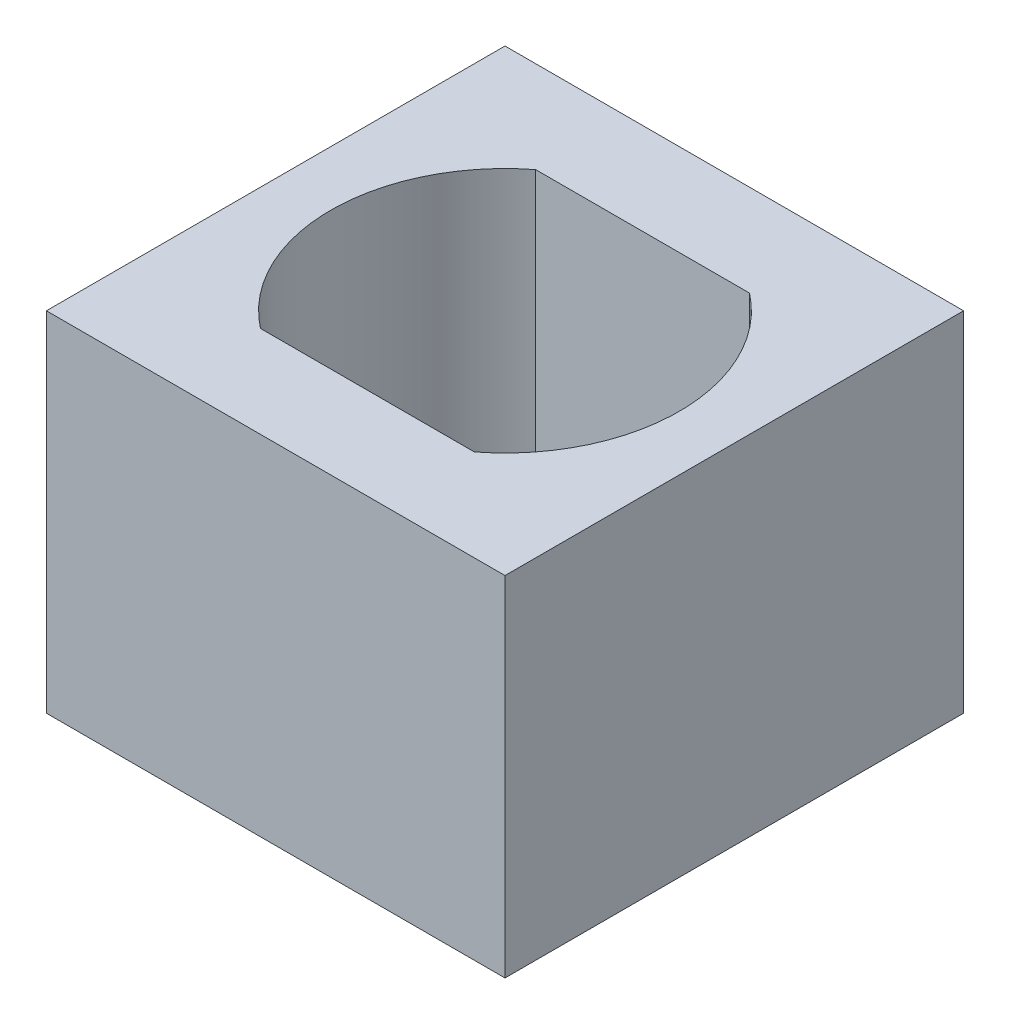
ISO-10303-21;
HEADER;
FILE_DESCRIPTION(('STEP AP214'),'2;1');
FILE_NAME('part.step','',(''),(''),'','','');
FILE_SCHEMA(('AUTOMOTIVE_DESIGN { 1 0 10303 214 1 1 1 1 }'));
ENDSEC;
DATA;
#1=APPLICATION_CONTEXT('core data for automotive mechanical design processes');
#2=APPLICATION_PROTOCOL_DEFINITION('international standard','automotive_design',2000,#1);
#3=PRODUCT_CONTEXT('',#1,'mechanical');
#4=PRODUCT('Part','Part','',(#3));
#5=PRODUCT_RELATED_PRODUCT_CATEGORY('part','',(#4));
#6=PRODUCT_DEFINITION_FORMATION('','',#4);
#7=PRODUCT_DEFINITION_CONTEXT('part definition',#1,'design');
#8=PRODUCT_DEFINITION('design','',#6,#7);
#9=PRODUCT_DEFINITION_SHAPE('','',#8);
#10=(LENGTH_UNIT() NAMED_UNIT(*) SI_UNIT(.MILLI.,.METRE.));
#11=(NAMED_UNIT(*) PLANE_ANGLE_UNIT() SI_UNIT($,.RADIAN.));
#12=(NAMED_UNIT(*) SI_UNIT($,.STERADIAN.) SOLID_ANGLE_UNIT());
#13=UNCERTAINTY_MEASURE_WITH_UNIT(LENGTH_MEASURE(1.E-05),#10,'distance_accuracy_value','');
#14=(GEOMETRIC_REPRESENTATION_CONTEXT(3) GLOBAL_UNCERTAINTY_ASSIGNED_CONTEXT((#13)) GLOBAL_UNIT_ASSIGNED_CONTEXT((#10,
#11,#12)) REPRESENTATION_CONTEXT('',''));
#15=CARTESIAN_POINT('',(0.,0.,0.));
#16=DIRECTION('',(0.,0.,1.));
#17=DIRECTION('',(1.,0.,0.));
#18=AXIS2_PLACEMENT_3D('',#15,#16,#17);
#19=CARTESIAN_POINT('',(-12.5,12.5,12.5));
#20=DIRECTION('',(-1.,0.,0.));
#21=DIRECTION('',(0.,0.,1.));
#22=AXIS2_PLACEMENT_3D('',#19,#20,#21);
#23=PLANE('',#22);
#24=DIRECTION('',(0.,-1.,0.));
#25=VECTOR('',#24,1.);
#26=CARTESIAN_POINT('',(-12.5,12.5,25.));
#27=LINE('',#26,#25);
#28=CARTESIAN_POINT('',(-12.5,6.5,25.));
#29=VERTEX_POINT('',#28);
#30=CARTESIAN_POINT('',(-12.5,-12.5,25.));
#31=VERTEX_POINT('',#30);
#32=EDGE_CURVE('E163',#29,#31,#27,.T.);
#33=ORIENTED_EDGE('',*,*,#32,.F.);
#34=DIRECTION('',(0.,0.,1.));
#35=VECTOR('',#34,1.);
#36=CARTESIAN_POINT('',(-12.5,6.5,0.));
#37=LINE('',#36,#35);
#38=CARTESIAN_POINT('',(-12.5,6.5,0.));
#39=VERTEX_POINT('',#38);
#40=EDGE_CURVE('E12',#39,#29,#37,.T.);
#41=ORIENTED_EDGE('',*,*,#40,.F.);
#42=DIRECTION('',(0.,1.,0.));
#43=VECTOR('',#42,1.);
#44=CARTESIAN_POINT('',(-12.5,0.,0.));
#45=LINE('',#44,#43);
#46=CARTESIAN_POINT('',(-12.5,-12.5,0.));
#47=VERTEX_POINT('',#46);
#48=EDGE_CURVE('E134',#47,#39,#45,.T.);
#49=ORIENTED_EDGE('',*,*,#48,.F.);
#50=DIRECTION('',(0.,0.,-1.));
#51=VECTOR('',#50,1.);
#52=CARTESIAN_POINT('',(-12.5,-12.5,12.5));
#53=LINE('',#52,#51);
#54=EDGE_CURVE('E60',#31,#47,#53,.T.);
#55=ORIENTED_EDGE('',*,*,#54,.F.);
#56=EDGE_LOOP('',(#33,#41,#49,#55));
#57=FACE_BOUND('',#56,.T.);
#58=ADVANCED_FACE('F52',(#57),#23,.T.);
#59=CARTESIAN_POINT('',(0.,-12.5,25.));
#60=DIRECTION('',(0.,-1.,0.));
#61=DIRECTION('',(0.,0.,-1.));
#62=AXIS2_PLACEMENT_3D('',#59,#60,#61);
#63=PLANE('',#62);
#64=DIRECTION('',(-1.,0.,0.));
#65=VECTOR('',#64,1.);
#66=CARTESIAN_POINT('',(0.,-12.5,0.));
#67=LINE('',#66,#65);
#68=CARTESIAN_POINT('',(12.5,-12.5,0.));
#69=VERTEX_POINT('',#68);
#70=EDGE_CURVE('E126',#69,#47,#67,.T.);
#71=ORIENTED_EDGE('',*,*,#70,.F.);
#72=DIRECTION('',(0.,0.,-1.));
#73=VECTOR('',#72,1.);
#74=CARTESIAN_POINT('',(12.5,-12.5,12.5));
#75=LINE('',#74,#73);
#76=CARTESIAN_POINT('',(12.5,-12.5,25.));
#77=VERTEX_POINT('',#76);
#78=EDGE_CURVE('E115',#77,#69,#75,.T.);
#79=ORIENTED_EDGE('',*,*,#78,.F.);
#80=DIRECTION('',(-1.,0.,0.));
#81=VECTOR('',#80,1.);
#82=CARTESIAN_POINT('',(0.,-12.5,25.));
#83=LINE('',#82,#81);
#84=EDGE_CURVE('E139',#77,#31,#83,.T.);
#85=ORIENTED_EDGE('',*,*,#84,.T.);
#86=ORIENTED_EDGE('',*,*,#54,.T.);
#87=EDGE_LOOP('',(#71,#79,#85,#86));
#88=FACE_BOUND('',#87,.T.);
#89=CARTESIAN_POINT('',(0.,-12.5,12.5));
#90=DIRECTION('',(0.,-1.,0.));
#91=DIRECTION('',(0.,0.,-1.));
#92=AXIS2_PLACEMENT_3D('',#89,#90,#91);
#93=CIRCLE('',#92,9.5);
#94=CARTESIAN_POINT('',(5.8309518948453,-12.5,5.));
#95=VERTEX_POINT('',#94);
#96=CARTESIAN_POINT('',(5.8309518948453,-12.5,20.));
#97=VERTEX_POINT('',#96);
#98=EDGE_CURVE('E159',#95,#97,#93,.T.);
#99=ORIENTED_EDGE('',*,*,#98,.F.);
#100=DIRECTION('',(-1.,0.,0.));
#101=VECTOR('',#100,1.);
#102=CARTESIAN_POINT('',(0.,-12.5,5.));
#103=LINE('',#102,#101);
#104=CARTESIAN_POINT('',(-5.8309518948453,-12.5,5.));
#105=VERTEX_POINT('',#104);
#106=EDGE_CURVE('E156',#95,#105,#103,.T.);
#107=ORIENTED_EDGE('',*,*,#106,.T.);
#108=CARTESIAN_POINT('',(0.,-12.5,12.5));
#109=DIRECTION('',(0.,-1.,0.));
#110=DIRECTION('',(0.,0.,-1.));
#111=AXIS2_PLACEMENT_3D('',#108,#109,#110);
#112=CIRCLE('',#111,9.5);
#113=CARTESIAN_POINT('',(-5.83095189484531,-12.5,20.));
#114=VERTEX_POINT('',#113);
#115=EDGE_CURVE('E152',#114,#105,#112,.T.);
#116=ORIENTED_EDGE('',*,*,#115,.F.);
#117=DIRECTION('',(-1.,0.,0.));
#118=VECTOR('',#117,1.);
#119=CARTESIAN_POINT('',(0.,-12.5,20.));
#120=LINE('',#119,#118);
#121=EDGE_CURVE('E145',#97,#114,#120,.T.);
#122=ORIENTED_EDGE('',*,*,#121,.F.);
#123=EDGE_LOOP('',(#99,#107,#116,#122));
#124=FACE_BOUND('',#123,.T.);
#125=ADVANCED_FACE('F136',(#88,#124),#63,.T.);
#126=CARTESIAN_POINT('',(0.,0.,0.));
#127=DIRECTION('',(0.,0.,1.));
#128=DIRECTION('',(1.,0.,0.));
#129=AXIS2_PLACEMENT_3D('',#126,#127,#128);
#130=PLANE('',#129);
#131=DIRECTION('',(1.,0.,0.));
#132=VECTOR('',#131,1.);
#133=CARTESIAN_POINT('',(0.,6.5,0.));
#134=LINE('',#133,#132);
#135=CARTESIAN_POINT('',(12.5,6.5,0.));
#136=VERTEX_POINT('',#135);
#137=EDGE_CURVE('E132',#39,#136,#134,.T.);
#138=ORIENTED_EDGE('',*,*,#137,.T.);
#139=DIRECTION('',(0.,-1.,0.));
#140=VECTOR('',#139,1.);
#141=CARTESIAN_POINT('',(12.5,0.,0.));
#142=LINE('',#141,#140);
#143=EDGE_CURVE('E118',#136,#69,#142,.T.);
#144=ORIENTED_EDGE('',*,*,#143,.T.);
#145=ORIENTED_EDGE('',*,*,#70,.T.);
#146=ORIENTED_EDGE('',*,*,#48,.T.);
#147=EDGE_LOOP('',(#138,#144,#145,#146));
#148=FACE_BOUND('',#147,.T.);
#149=ADVANCED_FACE('F130',(#148),#130,.F.);
#150=CARTESIAN_POINT('',(0.,0.,25.));
#151=DIRECTION('',(0.,0.,1.));
#152=DIRECTION('',(1.,0.,0.));
#153=AXIS2_PLACEMENT_3D('',#150,#151,#152);
#154=PLANE('',#153);
#155=DIRECTION('',(1.,0.,0.));
#156=VECTOR('',#155,1.);
#157=CARTESIAN_POINT('',(0.,6.5,25.));
#158=LINE('',#157,#156);
#159=CARTESIAN_POINT('',(12.5,6.5,25.));
#160=VERTEX_POINT('',#159);
#161=EDGE_CURVE('E127',#29,#160,#158,.T.);
#162=ORIENTED_EDGE('',*,*,#161,.F.);
#163=ORIENTED_EDGE('',*,*,#32,.T.);
#164=ORIENTED_EDGE('',*,*,#84,.F.);
#165=DIRECTION('',(0.,-1.,0.));
#166=VECTOR('',#165,1.);
#167=CARTESIAN_POINT('',(12.5,12.5,25.));
#168=LINE('',#167,#166);
#169=EDGE_CURVE('E121',#160,#77,#168,.T.);
#170=ORIENTED_EDGE('',*,*,#169,.F.);
#171=EDGE_LOOP('',(#162,#163,#164,#170));
#172=FACE_BOUND('',#171,.T.);
#173=ADVANCED_FACE('F299',(#172),#154,.T.);
#174=CARTESIAN_POINT('',(0.,6.5,5.));
#175=DIRECTION('',(0.,0.,1.));
#176=DIRECTION('',(1.,0.,0.));
#177=AXIS2_PLACEMENT_3D('',#174,#175,#176);
#178=PLANE('',#177);
#179=ORIENTED_EDGE('',*,*,#106,.F.);
#180=DIRECTION('',(0.,-1.,0.));
#181=VECTOR('',#180,1.);
#182=CARTESIAN_POINT('',(5.8309518948453,6.5,5.));
#183=LINE('',#182,#181);
#184=CARTESIAN_POINT('',(5.8309518948453,6.5,5.));
#185=VERTEX_POINT('',#184);
#186=EDGE_CURVE('E219',#185,#95,#183,.T.);
#187=ORIENTED_EDGE('',*,*,#186,.F.);
#188=DIRECTION('',(-1.,0.,0.));
#189=VECTOR('',#188,1.);
#190=CARTESIAN_POINT('',(0.,6.5,5.));
#191=LINE('',#190,#189);
#192=CARTESIAN_POINT('',(-5.8309518948453,6.5,5.));
#193=VERTEX_POINT('',#192);
#194=EDGE_CURVE('E227',#185,#193,#191,.T.);
#195=ORIENTED_EDGE('',*,*,#194,.T.);
#196=DIRECTION('',(0.,-1.,0.));
#197=VECTOR('',#196,1.);
#198=CARTESIAN_POINT('',(-5.8309518948453,6.5,5.));
#199=LINE('',#198,#197);
#200=EDGE_CURVE('E234',#193,#105,#199,.T.);
#201=ORIENTED_EDGE('',*,*,#200,.T.);
#202=EDGE_LOOP('',(#179,#187,#195,#201));
#203=FACE_BOUND('',#202,.T.);
#204=ADVANCED_FACE('F398',(#203),#178,.T.);
#205=CARTESIAN_POINT('',(0.,6.5,12.5));
#206=DIRECTION('',(0.,-1.,0.));
#207=DIRECTION('',(0.,0.,-1.));
#208=AXIS2_PLACEMENT_3D('',#205,#206,#207);
#209=CYLINDRICAL_SURFACE('',#208,9.5);
#210=ORIENTED_EDGE('',*,*,#98,.T.);
#211=DIRECTION('',(0.,-1.,0.));
#212=VECTOR('',#211,1.);
#213=CARTESIAN_POINT('',(5.8309518948453,6.5,20.));
#214=LINE('',#213,#212);
#215=CARTESIAN_POINT('',(5.8309518948453,6.5,20.));
#216=VERTEX_POINT('',#215);
#217=EDGE_CURVE('E242',#216,#97,#214,.T.);
#218=ORIENTED_EDGE('',*,*,#217,.F.);
#219=CARTESIAN_POINT('',(0.,6.5,12.5));
#220=DIRECTION('',(0.,-1.,0.));
#221=DIRECTION('',(0.,0.,-1.));
#222=AXIS2_PLACEMENT_3D('',#219,#220,#221);
#223=CIRCLE('',#222,9.5);
#224=EDGE_CURVE('E250',#185,#216,#223,.T.);
#225=ORIENTED_EDGE('',*,*,#224,.F.);
#226=ORIENTED_EDGE('',*,*,#186,.T.);
#227=EDGE_LOOP('',(#210,#218,#225,#226));
#228=FACE_BOUND('',#227,.T.);
#229=ADVANCED_FACE('F404',(#228),#209,.F.);
#230=CARTESIAN_POINT('',(0.,6.5,20.));
#231=DIRECTION('',(0.,0.,1.));
#232=DIRECTION('',(1.,0.,0.));
#233=AXIS2_PLACEMENT_3D('',#230,#231,#232);
#234=PLANE('',#233);
#235=ORIENTED_EDGE('',*,*,#121,.T.);
#236=DIRECTION('',(0.,-1.,0.));
#237=VECTOR('',#236,1.);
#238=CARTESIAN_POINT('',(-5.83095189484531,6.5,20.));
#239=LINE('',#238,#237);
#240=CARTESIAN_POINT('',(-5.83095189484531,6.5,20.));
#241=VERTEX_POINT('',#240);
#242=EDGE_CURVE('E258',#241,#114,#239,.T.);
#243=ORIENTED_EDGE('',*,*,#242,.F.);
#244=DIRECTION('',(-1.,0.,0.));
#245=VECTOR('',#244,1.);
#246=CARTESIAN_POINT('',(0.,6.5,20.));
#247=LINE('',#246,#245);
#248=EDGE_CURVE('E266',#216,#241,#247,.T.);
#249=ORIENTED_EDGE('',*,*,#248,.F.);
#250=ORIENTED_EDGE('',*,*,#217,.T.);
#251=EDGE_LOOP('',(#235,#243,#249,#250));
#252=FACE_BOUND('',#251,.T.);
#253=ADVANCED_FACE('F415',(#252),#234,.F.);
#254=CARTESIAN_POINT('',(0.,6.5,12.5));
#255=DIRECTION('',(0.,-1.,0.));
#256=DIRECTION('',(0.,0.,-1.));
#257=AXIS2_PLACEMENT_3D('',#254,#255,#256);
#258=CYLINDRICAL_SURFACE('',#257,9.5);
#259=ORIENTED_EDGE('',*,*,#115,.T.);
#260=ORIENTED_EDGE('',*,*,#200,.F.);
#261=CARTESIAN_POINT('',(0.,6.5,12.5));
#262=DIRECTION('',(0.,-1.,0.));
#263=DIRECTION('',(0.,0.,-1.));
#264=AXIS2_PLACEMENT_3D('',#261,#262,#263);
#265=CIRCLE('',#264,9.5);
#266=EDGE_CURVE('E274',#241,#193,#265,.T.);
#267=ORIENTED_EDGE('',*,*,#266,.F.);
#268=ORIENTED_EDGE('',*,*,#242,.T.);
#269=EDGE_LOOP('',(#259,#260,#267,#268));
#270=FACE_BOUND('',#269,.T.);
#271=ADVANCED_FACE('F362',(#270),#258,.F.);
#272=CARTESIAN_POINT('',(12.5,12.5,12.5));
#273=DIRECTION('',(-1.,0.,0.));
#274=DIRECTION('',(0.,0.,1.));
#275=AXIS2_PLACEMENT_3D('',#272,#273,#274);
#276=PLANE('',#275);
#277=ORIENTED_EDGE('',*,*,#78,.T.);
#278=ORIENTED_EDGE('',*,*,#143,.F.);
#279=DIRECTION('',(0.,0.,1.));
#280=VECTOR('',#279,1.);
#281=CARTESIAN_POINT('',(12.5,6.5,0.));
#282=LINE('',#281,#280);
#283=EDGE_CURVE('E282',#136,#160,#282,.T.);
#284=ORIENTED_EDGE('',*,*,#283,.T.);
#285=ORIENTED_EDGE('',*,*,#169,.T.);
#286=EDGE_LOOP('',(#277,#278,#284,#285));
#287=FACE_BOUND('',#286,.T.);
#288=ADVANCED_FACE('F117',(#287),#276,.F.);
#289=CARTESIAN_POINT('',(0.,6.5,0.));
#290=DIRECTION('',(0.,-1.,0.));
#291=DIRECTION('',(0.,0.,-1.));
#292=AXIS2_PLACEMENT_3D('',#289,#290,#291);
#293=PLANE('',#292);
#294=ORIENTED_EDGE('',*,*,#161,.T.);
#295=ORIENTED_EDGE('',*,*,#283,.F.);
#296=ORIENTED_EDGE('',*,*,#137,.F.);
#297=ORIENTED_EDGE('',*,*,#40,.T.);
#298=EDGE_LOOP('',(#294,#295,#296,#297));
#299=FACE_BOUND('',#298,.T.);
#300=ORIENTED_EDGE('',*,*,#224,.T.);
#301=ORIENTED_EDGE('',*,*,#248,.T.);
#302=ORIENTED_EDGE('',*,*,#266,.T.);
#303=ORIENTED_EDGE('',*,*,#194,.F.);
#304=EDGE_LOOP('',(#300,#301,#302,#303));
#305=FACE_BOUND('',#304,.T.);
#306=ADVANCED_FACE('F361',(#299,#305),#293,.F.);
#307=CLOSED_SHELL('',(#58,#125,#149,#173,#204,#229,#253,#271,#288,#306));
#308=MANIFOLD_SOLID_BREP('B2',#307);
#309=ADVANCED_BREP_SHAPE_REPRESENTATION('',(#18,#308),#14);
#310=SHAPE_DEFINITION_REPRESENTATION(#9,#309);
ENDSEC;
END-ISO-10303-21;
